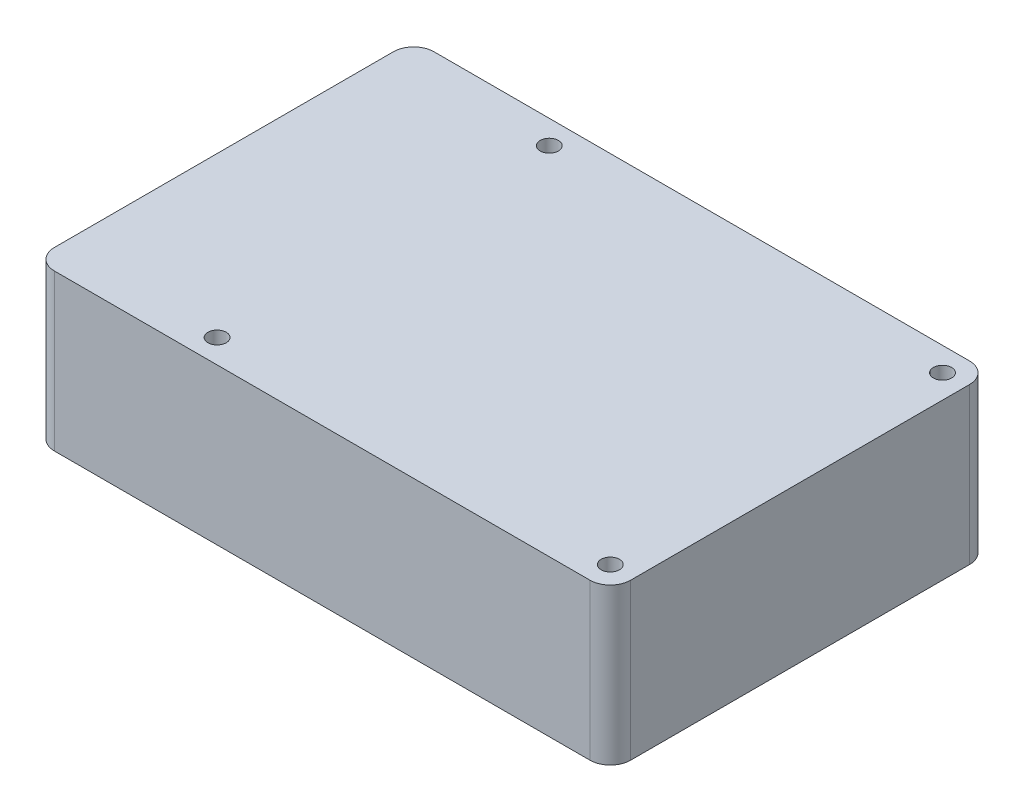
ISO-10303-21;
HEADER;
FILE_DESCRIPTION(('STEP AP214'),'2;1');
FILE_NAME('part.step','',(''),(''),'','','');
FILE_SCHEMA(('AUTOMOTIVE_DESIGN { 1 0 10303 214 1 1 1 1 }'));
ENDSEC;
DATA;
#1=APPLICATION_CONTEXT('core data for automotive mechanical design processes');
#2=APPLICATION_PROTOCOL_DEFINITION('international standard','automotive_design',2000,#1);
#3=PRODUCT_CONTEXT('',#1,'mechanical');
#4=PRODUCT('Part','Part','',(#3));
#5=PRODUCT_RELATED_PRODUCT_CATEGORY('part','',(#4));
#6=PRODUCT_DEFINITION_FORMATION('','',#4);
#7=PRODUCT_DEFINITION_CONTEXT('part definition',#1,'design');
#8=PRODUCT_DEFINITION('design','',#6,#7);
#9=PRODUCT_DEFINITION_SHAPE('','',#8);
#10=(LENGTH_UNIT() NAMED_UNIT(*) SI_UNIT(.MILLI.,.METRE.));
#11=(NAMED_UNIT(*) PLANE_ANGLE_UNIT() SI_UNIT($,.RADIAN.));
#12=(NAMED_UNIT(*) SI_UNIT($,.STERADIAN.) SOLID_ANGLE_UNIT());
#13=UNCERTAINTY_MEASURE_WITH_UNIT(LENGTH_MEASURE(1.E-05),#10,'distance_accuracy_value','');
#14=(GEOMETRIC_REPRESENTATION_CONTEXT(3) GLOBAL_UNCERTAINTY_ASSIGNED_CONTEXT((#13)) GLOBAL_UNIT_ASSIGNED_CONTEXT((#10,
#11,#12)) REPRESENTATION_CONTEXT('',''));
#15=CARTESIAN_POINT('',(0.,0.,0.));
#16=DIRECTION('',(0.,0.,1.));
#17=DIRECTION('',(1.,0.,0.));
#18=AXIS2_PLACEMENT_3D('',#15,#16,#17);
#19=CARTESIAN_POINT('',(-42.5,23.,28.));
#20=DIRECTION('',(1.,0.,0.));
#21=DIRECTION('',(0.,0.,-1.));
#22=AXIS2_PLACEMENT_3D('',#19,#20,#21);
#23=PLANE('',#22);
#24=DIRECTION('',(0.,0.,1.));
#25=VECTOR('',#24,1.);
#26=CARTESIAN_POINT('',(-42.5,23.,28.));
#27=LINE('',#26,#25);
#28=CARTESIAN_POINT('',(-42.5,23.,-25.));
#29=VERTEX_POINT('',#28);
#30=CARTESIAN_POINT('',(-42.5,23.,25.));
#31=VERTEX_POINT('',#30);
#32=EDGE_CURVE('E131',#29,#31,#27,.T.);
#33=ORIENTED_EDGE('',*,*,#32,.F.);
#34=DIRECTION('',(0.,-1.,0.));
#35=VECTOR('',#34,1.);
#36=CARTESIAN_POINT('',(-42.5,23.,-25.));
#37=LINE('',#36,#35);
#38=CARTESIAN_POINT('',(-42.5,0.,-25.));
#39=VERTEX_POINT('',#38);
#40=EDGE_CURVE('E120',#29,#39,#37,.T.);
#41=ORIENTED_EDGE('',*,*,#40,.T.);
#42=DIRECTION('',(0.,0.,1.));
#43=VECTOR('',#42,1.);
#44=CARTESIAN_POINT('',(-42.5,0.,28.));
#45=LINE('',#44,#43);
#46=CARTESIAN_POINT('',(-42.5,0.,25.));
#47=VERTEX_POINT('',#46);
#48=EDGE_CURVE('E128',#39,#47,#45,.T.);
#49=ORIENTED_EDGE('',*,*,#48,.T.);
#50=DIRECTION('',(0.,-1.,0.));
#51=VECTOR('',#50,1.);
#52=CARTESIAN_POINT('',(-42.5,23.,25.));
#53=LINE('',#52,#51);
#54=EDGE_CURVE('E136',#47,#31,#53,.F.);
#55=ORIENTED_EDGE('',*,*,#54,.T.);
#56=EDGE_LOOP('',(#33,#41,#49,#55));
#57=FACE_BOUND('',#56,.T.);
#58=ADVANCED_FACE('F44',(#57),#23,.F.);
#59=CARTESIAN_POINT('',(42.5,23.,28.));
#60=DIRECTION('',(0.,0.,-1.));
#61=DIRECTION('',(-1.,0.,0.));
#62=AXIS2_PLACEMENT_3D('',#59,#60,#61);
#63=PLANE('',#62);
#64=DIRECTION('',(1.,0.,0.));
#65=VECTOR('',#64,1.);
#66=CARTESIAN_POINT('',(42.5,23.,28.));
#67=LINE('',#66,#65);
#68=CARTESIAN_POINT('',(-39.5,23.,28.));
#69=VERTEX_POINT('',#68);
#70=CARTESIAN_POINT('',(39.5,23.,28.));
#71=VERTEX_POINT('',#70);
#72=EDGE_CURVE('E198',#69,#71,#67,.T.);
#73=ORIENTED_EDGE('',*,*,#72,.F.);
#74=DIRECTION('',(0.,-1.,0.));
#75=VECTOR('',#74,1.);
#76=CARTESIAN_POINT('',(-39.5,23.,28.));
#77=LINE('',#76,#75);
#78=CARTESIAN_POINT('',(-39.5,0.,28.));
#79=VERTEX_POINT('',#78);
#80=EDGE_CURVE('E11',#69,#79,#77,.T.);
#81=ORIENTED_EDGE('',*,*,#80,.T.);
#82=DIRECTION('',(1.,0.,0.));
#83=VECTOR('',#82,1.);
#84=CARTESIAN_POINT('',(42.5,0.,28.));
#85=LINE('',#84,#83);
#86=CARTESIAN_POINT('',(39.5,0.,28.));
#87=VERTEX_POINT('',#86);
#88=EDGE_CURVE('E142',#79,#87,#85,.T.);
#89=ORIENTED_EDGE('',*,*,#88,.T.);
#90=DIRECTION('',(0.,-1.,0.));
#91=VECTOR('',#90,1.);
#92=CARTESIAN_POINT('',(39.5,23.,28.));
#93=LINE('',#92,#91);
#94=EDGE_CURVE('E53',#87,#71,#93,.F.);
#95=ORIENTED_EDGE('',*,*,#94,.T.);
#96=EDGE_LOOP('',(#73,#81,#89,#95));
#97=FACE_BOUND('',#96,.T.);
#98=ADVANCED_FACE('F195',(#97),#63,.F.);
#99=CARTESIAN_POINT('',(42.5,23.,28.));
#100=DIRECTION('',(-1.,0.,0.));
#101=DIRECTION('',(0.,0.,1.));
#102=AXIS2_PLACEMENT_3D('',#99,#100,#101);
#103=PLANE('',#102);
#104=DIRECTION('',(0.,0.,-1.));
#105=VECTOR('',#104,1.);
#106=CARTESIAN_POINT('',(42.5,0.,28.));
#107=LINE('',#106,#105);
#108=CARTESIAN_POINT('',(42.5,0.,25.));
#109=VERTEX_POINT('',#108);
#110=CARTESIAN_POINT('',(42.5,0.,-25.));
#111=VERTEX_POINT('',#110);
#112=EDGE_CURVE('E146',#109,#111,#107,.T.);
#113=ORIENTED_EDGE('',*,*,#112,.T.);
#114=DIRECTION('',(0.,-1.,0.));
#115=VECTOR('',#114,1.);
#116=CARTESIAN_POINT('',(42.5,23.,-25.));
#117=LINE('',#116,#115);
#118=CARTESIAN_POINT('',(42.5,23.,-25.));
#119=VERTEX_POINT('',#118);
#120=EDGE_CURVE('E63',#111,#119,#117,.F.);
#121=ORIENTED_EDGE('',*,*,#120,.T.);
#122=DIRECTION('',(0.,0.,-1.));
#123=VECTOR('',#122,1.);
#124=CARTESIAN_POINT('',(42.5,23.,28.));
#125=LINE('',#124,#123);
#126=CARTESIAN_POINT('',(42.5,23.,25.));
#127=VERTEX_POINT('',#126);
#128=EDGE_CURVE('E201',#127,#119,#125,.T.);
#129=ORIENTED_EDGE('',*,*,#128,.F.);
#130=DIRECTION('',(0.,-1.,0.));
#131=VECTOR('',#130,1.);
#132=CARTESIAN_POINT('',(42.5,23.,25.));
#133=LINE('',#132,#131);
#134=EDGE_CURVE('E188',#127,#109,#133,.T.);
#135=ORIENTED_EDGE('',*,*,#134,.T.);
#136=EDGE_LOOP('',(#113,#121,#129,#135));
#137=FACE_BOUND('',#136,.T.);
#138=ADVANCED_FACE('F210',(#137),#103,.F.);
#139=CARTESIAN_POINT('',(42.5,23.,-28.));
#140=DIRECTION('',(0.,0.,1.));
#141=DIRECTION('',(1.,0.,0.));
#142=AXIS2_PLACEMENT_3D('',#139,#140,#141);
#143=PLANE('',#142);
#144=DIRECTION('',(-1.,0.,0.));
#145=VECTOR('',#144,1.);
#146=CARTESIAN_POINT('',(42.5,0.,-28.));
#147=LINE('',#146,#145);
#148=CARTESIAN_POINT('',(39.5,0.,-28.));
#149=VERTEX_POINT('',#148);
#150=CARTESIAN_POINT('',(-39.5,0.,-28.));
#151=VERTEX_POINT('',#150);
#152=EDGE_CURVE('E157',#149,#151,#147,.T.);
#153=ORIENTED_EDGE('',*,*,#152,.T.);
#154=DIRECTION('',(0.,-1.,0.));
#155=VECTOR('',#154,1.);
#156=CARTESIAN_POINT('',(-39.5,23.,-28.));
#157=LINE('',#156,#155);
#158=CARTESIAN_POINT('',(-39.5,23.,-28.));
#159=VERTEX_POINT('',#158);
#160=EDGE_CURVE('E116',#151,#159,#157,.F.);
#161=ORIENTED_EDGE('',*,*,#160,.T.);
#162=DIRECTION('',(-1.,0.,0.));
#163=VECTOR('',#162,1.);
#164=CARTESIAN_POINT('',(42.5,23.,-28.));
#165=LINE('',#164,#163);
#166=CARTESIAN_POINT('',(39.5,23.,-28.));
#167=VERTEX_POINT('',#166);
#168=EDGE_CURVE('E152',#167,#159,#165,.T.);
#169=ORIENTED_EDGE('',*,*,#168,.F.);
#170=DIRECTION('',(0.,-1.,0.));
#171=VECTOR('',#170,1.);
#172=CARTESIAN_POINT('',(39.5,23.,-28.));
#173=LINE('',#172,#171);
#174=EDGE_CURVE('E123',#167,#149,#173,.T.);
#175=ORIENTED_EDGE('',*,*,#174,.T.);
#176=EDGE_LOOP('',(#153,#161,#169,#175));
#177=FACE_BOUND('',#176,.T.);
#178=ADVANCED_FACE('F212',(#177),#143,.F.);
#179=CARTESIAN_POINT('',(0.,23.,0.));
#180=DIRECTION('',(0.,1.,0.));
#181=DIRECTION('',(0.,0.,1.));
#182=AXIS2_PLACEMENT_3D('',#179,#180,#181);
#183=PLANE('',#182);
#184=CARTESIAN_POINT('',(-19.,23.,-24.5));
#185=DIRECTION('',(0.,1.,0.));
#186=DIRECTION('',(0.,0.,1.));
#187=AXIS2_PLACEMENT_3D('',#184,#185,#186);
#188=CIRCLE('',#187,1.35);
#189=CARTESIAN_POINT('',(-19.,23.,-23.15));
#190=VERTEX_POINT('',#189);
#191=EDGE_CURVE('E225',#190,#190,#188,.T.);
#192=ORIENTED_EDGE('',*,*,#191,.F.);
#193=EDGE_LOOP('',(#192));
#194=FACE_BOUND('',#193,.T.);
#195=CARTESIAN_POINT('',(39.,23.,24.5));
#196=DIRECTION('',(0.,1.,0.));
#197=DIRECTION('',(0.,0.,1.));
#198=AXIS2_PLACEMENT_3D('',#195,#196,#197);
#199=CIRCLE('',#198,1.35);
#200=CARTESIAN_POINT('',(39.,23.,25.85));
#201=VERTEX_POINT('',#200);
#202=EDGE_CURVE('E226',#201,#201,#199,.T.);
#203=ORIENTED_EDGE('',*,*,#202,.F.);
#204=EDGE_LOOP('',(#203));
#205=FACE_BOUND('',#204,.T.);
#206=CARTESIAN_POINT('',(-19.,23.,24.5));
#207=DIRECTION('',(0.,1.,0.));
#208=DIRECTION('',(0.,0.,1.));
#209=AXIS2_PLACEMENT_3D('',#206,#207,#208);
#210=CIRCLE('',#209,1.35);
#211=CARTESIAN_POINT('',(-19.,23.,25.85));
#212=VERTEX_POINT('',#211);
#213=EDGE_CURVE('E227',#212,#212,#210,.T.);
#214=ORIENTED_EDGE('',*,*,#213,.F.);
#215=EDGE_LOOP('',(#214));
#216=FACE_BOUND('',#215,.T.);
#217=CARTESIAN_POINT('',(39.,23.,-24.5));
#218=DIRECTION('',(0.,1.,0.));
#219=DIRECTION('',(0.,0.,1.));
#220=AXIS2_PLACEMENT_3D('',#217,#218,#219);
#221=CIRCLE('',#220,1.35);
#222=CARTESIAN_POINT('',(39.,23.,-23.15));
#223=VERTEX_POINT('',#222);
#224=EDGE_CURVE('E151',#223,#223,#221,.T.);
#225=ORIENTED_EDGE('',*,*,#224,.F.);
#226=EDGE_LOOP('',(#225));
#227=FACE_BOUND('',#226,.T.);
#228=ORIENTED_EDGE('',*,*,#168,.T.);
#229=CARTESIAN_POINT('',(-39.5,23.,-25.));
#230=DIRECTION('',(0.,1.,0.));
#231=DIRECTION('',(0.,0.,1.));
#232=AXIS2_PLACEMENT_3D('',#229,#230,#231);
#233=CIRCLE('',#232,3.);
#234=EDGE_CURVE('E181',#159,#29,#233,.T.);
#235=ORIENTED_EDGE('',*,*,#234,.T.);
#236=ORIENTED_EDGE('',*,*,#32,.T.);
#237=CARTESIAN_POINT('',(-39.5,23.,25.));
#238=DIRECTION('',(0.,1.,0.));
#239=DIRECTION('',(0.,0.,1.));
#240=AXIS2_PLACEMENT_3D('',#237,#238,#239);
#241=CIRCLE('',#240,3.);
#242=EDGE_CURVE('E177',#31,#69,#241,.T.);
#243=ORIENTED_EDGE('',*,*,#242,.T.);
#244=ORIENTED_EDGE('',*,*,#72,.T.);
#245=CARTESIAN_POINT('',(39.5,23.,25.));
#246=DIRECTION('',(0.,1.,0.));
#247=DIRECTION('',(0.,0.,1.));
#248=AXIS2_PLACEMENT_3D('',#245,#246,#247);
#249=CIRCLE('',#248,3.);
#250=EDGE_CURVE('E69',#71,#127,#249,.T.);
#251=ORIENTED_EDGE('',*,*,#250,.T.);
#252=ORIENTED_EDGE('',*,*,#128,.T.);
#253=CARTESIAN_POINT('',(39.5,23.,-25.));
#254=DIRECTION('',(0.,1.,0.));
#255=DIRECTION('',(0.,0.,1.));
#256=AXIS2_PLACEMENT_3D('',#253,#254,#255);
#257=CIRCLE('',#256,3.);
#258=EDGE_CURVE('E180',#119,#167,#257,.T.);
#259=ORIENTED_EDGE('',*,*,#258,.T.);
#260=EDGE_LOOP('',(#228,#235,#236,#243,#244,#251,#252,#259));
#261=FACE_BOUND('',#260,.T.);
#262=ADVANCED_FACE('F199',(#194,#205,#216,#227,#261),#183,.T.);
#263=CARTESIAN_POINT('',(0.,0.,0.));
#264=DIRECTION('',(0.,1.,0.));
#265=DIRECTION('',(0.,0.,1.));
#266=AXIS2_PLACEMENT_3D('',#263,#264,#265);
#267=PLANE('',#266);
#268=CARTESIAN_POINT('',(-19.,0.,-24.5));
#269=DIRECTION('',(0.,1.,0.));
#270=DIRECTION('',(0.,0.,1.));
#271=AXIS2_PLACEMENT_3D('',#268,#269,#270);
#272=CIRCLE('',#271,1.35);
#273=CARTESIAN_POINT('',(-19.,0.,-23.15));
#274=VERTEX_POINT('',#273);
#275=EDGE_CURVE('E234',#274,#274,#272,.T.);
#276=ORIENTED_EDGE('',*,*,#275,.T.);
#277=EDGE_LOOP('',(#276));
#278=FACE_BOUND('',#277,.T.);
#279=CARTESIAN_POINT('',(39.,0.,24.5));
#280=DIRECTION('',(0.,1.,0.));
#281=DIRECTION('',(0.,0.,1.));
#282=AXIS2_PLACEMENT_3D('',#279,#280,#281);
#283=CIRCLE('',#282,1.35);
#284=CARTESIAN_POINT('',(39.,0.,25.85));
#285=VERTEX_POINT('',#284);
#286=EDGE_CURVE('E221',#285,#285,#283,.T.);
#287=ORIENTED_EDGE('',*,*,#286,.T.);
#288=EDGE_LOOP('',(#287));
#289=FACE_BOUND('',#288,.T.);
#290=CARTESIAN_POINT('',(-19.,0.,24.5));
#291=DIRECTION('',(0.,1.,0.));
#292=DIRECTION('',(0.,0.,1.));
#293=AXIS2_PLACEMENT_3D('',#290,#291,#292);
#294=CIRCLE('',#293,1.35);
#295=CARTESIAN_POINT('',(-19.,0.,25.85));
#296=VERTEX_POINT('',#295);
#297=EDGE_CURVE('E238',#296,#296,#294,.T.);
#298=ORIENTED_EDGE('',*,*,#297,.T.);
#299=EDGE_LOOP('',(#298));
#300=FACE_BOUND('',#299,.T.);
#301=CARTESIAN_POINT('',(39.,0.,-24.5));
#302=DIRECTION('',(0.,1.,0.));
#303=DIRECTION('',(0.,0.,1.));
#304=AXIS2_PLACEMENT_3D('',#301,#302,#303);
#305=CIRCLE('',#304,1.35);
#306=CARTESIAN_POINT('',(39.,0.,-23.15));
#307=VERTEX_POINT('',#306);
#308=EDGE_CURVE('E141',#307,#307,#305,.T.);
#309=ORIENTED_EDGE('',*,*,#308,.T.);
#310=EDGE_LOOP('',(#309));
#311=FACE_BOUND('',#310,.T.);
#312=ORIENTED_EDGE('',*,*,#48,.F.);
#313=CARTESIAN_POINT('',(-39.5,0.,-25.));
#314=DIRECTION('',(0.,1.,0.));
#315=DIRECTION('',(0.,0.,1.));
#316=AXIS2_PLACEMENT_3D('',#313,#314,#315);
#317=CIRCLE('',#316,3.);
#318=EDGE_CURVE('E114',#39,#151,#317,.F.);
#319=ORIENTED_EDGE('',*,*,#318,.T.);
#320=ORIENTED_EDGE('',*,*,#152,.F.);
#321=CARTESIAN_POINT('',(39.5,0.,-25.));
#322=DIRECTION('',(0.,1.,0.));
#323=DIRECTION('',(0.,0.,1.));
#324=AXIS2_PLACEMENT_3D('',#321,#322,#323);
#325=CIRCLE('',#324,3.);
#326=EDGE_CURVE('E125',#149,#111,#325,.F.);
#327=ORIENTED_EDGE('',*,*,#326,.T.);
#328=ORIENTED_EDGE('',*,*,#112,.F.);
#329=CARTESIAN_POINT('',(39.5,0.,25.));
#330=DIRECTION('',(0.,1.,0.));
#331=DIRECTION('',(0.,0.,1.));
#332=AXIS2_PLACEMENT_3D('',#329,#330,#331);
#333=CIRCLE('',#332,3.);
#334=EDGE_CURVE('E134',#109,#87,#333,.F.);
#335=ORIENTED_EDGE('',*,*,#334,.T.);
#336=ORIENTED_EDGE('',*,*,#88,.F.);
#337=CARTESIAN_POINT('',(-39.5,0.,25.));
#338=DIRECTION('',(0.,1.,0.));
#339=DIRECTION('',(0.,0.,1.));
#340=AXIS2_PLACEMENT_3D('',#337,#338,#339);
#341=CIRCLE('',#340,3.);
#342=EDGE_CURVE('E140',#79,#47,#341,.F.);
#343=ORIENTED_EDGE('',*,*,#342,.T.);
#344=EDGE_LOOP('',(#312,#319,#320,#327,#328,#335,#336,#343));
#345=FACE_BOUND('',#344,.T.);
#346=ADVANCED_FACE('F139',(#278,#289,#300,#311,#345),#267,.F.);
#347=CARTESIAN_POINT('',(-39.5,23.,-25.));
#348=DIRECTION('',(0.,-1.,0.));
#349=DIRECTION('',(0.,0.,-1.));
#350=AXIS2_PLACEMENT_3D('',#347,#348,#349);
#351=CYLINDRICAL_SURFACE('',#350,3.);
#352=ORIENTED_EDGE('',*,*,#234,.F.);
#353=ORIENTED_EDGE('',*,*,#160,.F.);
#354=ORIENTED_EDGE('',*,*,#318,.F.);
#355=ORIENTED_EDGE('',*,*,#40,.F.);
#356=EDGE_LOOP('',(#352,#353,#354,#355));
#357=FACE_BOUND('',#356,.T.);
#358=ADVANCED_FACE('F118',(#357),#351,.T.);
#359=CARTESIAN_POINT('',(39.5,23.,-25.));
#360=DIRECTION('',(0.,-1.,0.));
#361=DIRECTION('',(0.,0.,-1.));
#362=AXIS2_PLACEMENT_3D('',#359,#360,#361);
#363=CYLINDRICAL_SURFACE('',#362,3.);
#364=ORIENTED_EDGE('',*,*,#258,.F.);
#365=ORIENTED_EDGE('',*,*,#120,.F.);
#366=ORIENTED_EDGE('',*,*,#326,.F.);
#367=ORIENTED_EDGE('',*,*,#174,.F.);
#368=EDGE_LOOP('',(#364,#365,#366,#367));
#369=FACE_BOUND('',#368,.T.);
#370=ADVANCED_FACE('F211',(#369),#363,.T.);
#371=CARTESIAN_POINT('',(-39.5,23.,25.));
#372=DIRECTION('',(0.,-1.,0.));
#373=DIRECTION('',(0.,0.,-1.));
#374=AXIS2_PLACEMENT_3D('',#371,#372,#373);
#375=CYLINDRICAL_SURFACE('',#374,3.);
#376=ORIENTED_EDGE('',*,*,#242,.F.);
#377=ORIENTED_EDGE('',*,*,#54,.F.);
#378=ORIENTED_EDGE('',*,*,#342,.F.);
#379=ORIENTED_EDGE('',*,*,#80,.F.);
#380=EDGE_LOOP('',(#376,#377,#378,#379));
#381=FACE_BOUND('',#380,.T.);
#382=ADVANCED_FACE('F268',(#381),#375,.T.);
#383=CARTESIAN_POINT('',(39.5,23.,25.));
#384=DIRECTION('',(0.,-1.,0.));
#385=DIRECTION('',(0.,0.,-1.));
#386=AXIS2_PLACEMENT_3D('',#383,#384,#385);
#387=CYLINDRICAL_SURFACE('',#386,3.);
#388=ORIENTED_EDGE('',*,*,#250,.F.);
#389=ORIENTED_EDGE('',*,*,#94,.F.);
#390=ORIENTED_EDGE('',*,*,#334,.F.);
#391=ORIENTED_EDGE('',*,*,#134,.F.);
#392=EDGE_LOOP('',(#388,#389,#390,#391));
#393=FACE_BOUND('',#392,.T.);
#394=ADVANCED_FACE('F50',(#393),#387,.T.);
#395=CARTESIAN_POINT('',(39.,0.,-24.5));
#396=DIRECTION('',(0.,1.,0.));
#397=DIRECTION('',(0.,0.,1.));
#398=AXIS2_PLACEMENT_3D('',#395,#396,#397);
#399=CYLINDRICAL_SURFACE('',#398,1.35);
#400=ORIENTED_EDGE('',*,*,#308,.F.);
#401=EDGE_LOOP('',(#400));
#402=FACE_BOUND('',#401,.T.);
#403=ORIENTED_EDGE('',*,*,#224,.T.);
#404=EDGE_LOOP('',(#403));
#405=FACE_BOUND('',#404,.T.);
#406=ADVANCED_FACE('F258',(#402,#405),#399,.F.);
#407=CARTESIAN_POINT('',(-19.,0.,24.5));
#408=DIRECTION('',(0.,1.,0.));
#409=DIRECTION('',(0.,0.,1.));
#410=AXIS2_PLACEMENT_3D('',#407,#408,#409);
#411=CYLINDRICAL_SURFACE('',#410,1.35);
#412=ORIENTED_EDGE('',*,*,#297,.F.);
#413=EDGE_LOOP('',(#412));
#414=FACE_BOUND('',#413,.T.);
#415=ORIENTED_EDGE('',*,*,#213,.T.);
#416=EDGE_LOOP('',(#415));
#417=FACE_BOUND('',#416,.T.);
#418=ADVANCED_FACE('F249',(#414,#417),#411,.F.);
#419=CARTESIAN_POINT('',(39.,0.,24.5));
#420=DIRECTION('',(0.,1.,0.));
#421=DIRECTION('',(0.,0.,1.));
#422=AXIS2_PLACEMENT_3D('',#419,#420,#421);
#423=CYLINDRICAL_SURFACE('',#422,1.35);
#424=ORIENTED_EDGE('',*,*,#286,.F.);
#425=EDGE_LOOP('',(#424));
#426=FACE_BOUND('',#425,.T.);
#427=ORIENTED_EDGE('',*,*,#202,.T.);
#428=EDGE_LOOP('',(#427));
#429=FACE_BOUND('',#428,.T.);
#430=ADVANCED_FACE('F262',(#426,#429),#423,.F.);
#431=CARTESIAN_POINT('',(-19.,0.,-24.5));
#432=DIRECTION('',(0.,1.,0.));
#433=DIRECTION('',(0.,0.,1.));
#434=AXIS2_PLACEMENT_3D('',#431,#432,#433);
#435=CYLINDRICAL_SURFACE('',#434,1.35);
#436=ORIENTED_EDGE('',*,*,#275,.F.);
#437=EDGE_LOOP('',(#436));
#438=FACE_BOUND('',#437,.T.);
#439=ORIENTED_EDGE('',*,*,#191,.T.);
#440=EDGE_LOOP('',(#439));
#441=FACE_BOUND('',#440,.T.);
#442=ADVANCED_FACE('F340',(#438,#441),#435,.F.);
#443=CLOSED_SHELL('',(#58,#98,#138,#178,#262,#346,#358,#370,#382,#394,#406,#418,#430,#442));
#444=MANIFOLD_SOLID_BREP('B2',#443);
#445=ADVANCED_BREP_SHAPE_REPRESENTATION('',(#18,#444),#14);
#446=SHAPE_DEFINITION_REPRESENTATION(#9,#445);
ENDSEC;
END-ISO-10303-21;
